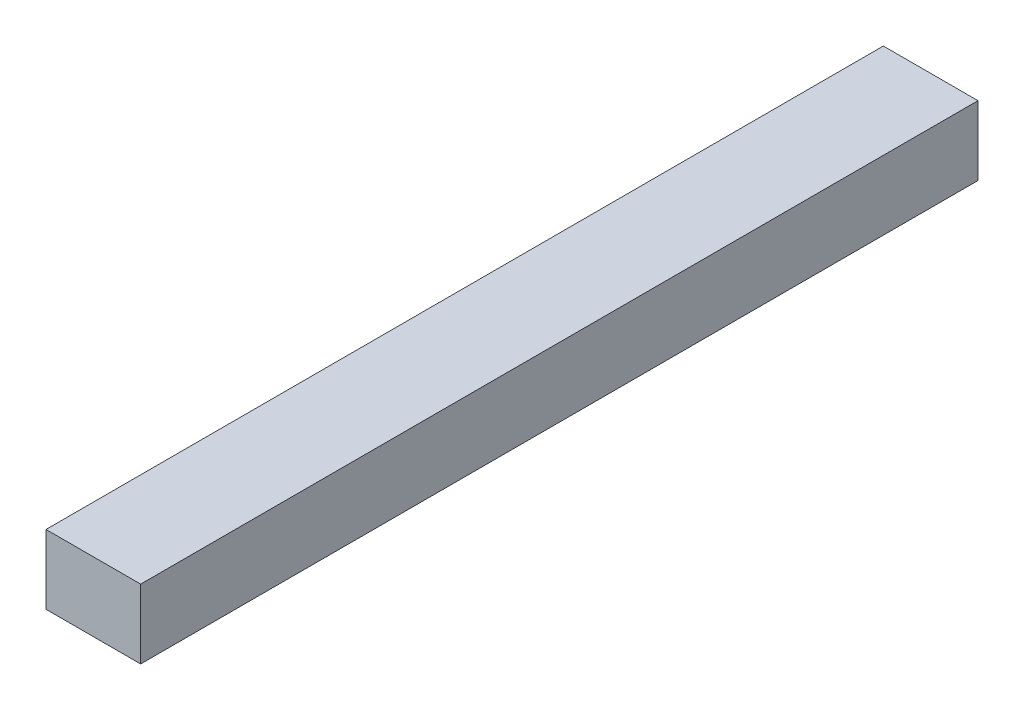
ISO-10303-21;
HEADER;
FILE_DESCRIPTION(('STEP AP214'),'2;1');
FILE_NAME('part.step','',(''),(''),'','','');
FILE_SCHEMA(('AUTOMOTIVE_DESIGN { 1 0 10303 214 1 1 1 1 }'));
ENDSEC;
DATA;
#1=APPLICATION_CONTEXT('core data for automotive mechanical design processes');
#2=APPLICATION_PROTOCOL_DEFINITION('international standard','automotive_design',2000,#1);
#3=PRODUCT_CONTEXT('',#1,'mechanical');
#4=PRODUCT('Part','Part','',(#3));
#5=PRODUCT_RELATED_PRODUCT_CATEGORY('part','',(#4));
#6=PRODUCT_DEFINITION_FORMATION('','',#4);
#7=PRODUCT_DEFINITION_CONTEXT('part definition',#1,'design');
#8=PRODUCT_DEFINITION('design','',#6,#7);
#9=PRODUCT_DEFINITION_SHAPE('','',#8);
#10=(LENGTH_UNIT() NAMED_UNIT(*) SI_UNIT(.MILLI.,.METRE.));
#11=(NAMED_UNIT(*) PLANE_ANGLE_UNIT() SI_UNIT($,.RADIAN.));
#12=(NAMED_UNIT(*) SI_UNIT($,.STERADIAN.) SOLID_ANGLE_UNIT());
#13=UNCERTAINTY_MEASURE_WITH_UNIT(LENGTH_MEASURE(1.E-05),#10,'distance_accuracy_value','');
#14=(GEOMETRIC_REPRESENTATION_CONTEXT(3) GLOBAL_UNCERTAINTY_ASSIGNED_CONTEXT((#13)) GLOBAL_UNIT_ASSIGNED_CONTEXT((#10,
#11,#12)) REPRESENTATION_CONTEXT('',''));
#15=CARTESIAN_POINT('',(0.,0.,0.));
#16=DIRECTION('',(0.,0.,1.));
#17=DIRECTION('',(1.,0.,0.));
#18=AXIS2_PLACEMENT_3D('',#15,#16,#17);
#19=CARTESIAN_POINT('',(6.5,4.75,57.5));
#20=DIRECTION('',(-1.,0.,0.));
#21=DIRECTION('',(0.,-1.,0.));
#22=AXIS2_PLACEMENT_3D('',#19,#20,#21);
#23=PLANE('',#22);
#24=DIRECTION('',(0.,1.,0.));
#25=VECTOR('',#24,1.);
#26=CARTESIAN_POINT('',(6.5,4.75,-57.5));
#27=LINE('',#26,#25);
#28=CARTESIAN_POINT('',(6.5,-4.75,-57.5));
#29=VERTEX_POINT('',#28);
#30=CARTESIAN_POINT('',(6.5,4.75,-57.5));
#31=VERTEX_POINT('',#30);
#32=EDGE_CURVE('E98',#29,#31,#27,.T.);
#33=ORIENTED_EDGE('',*,*,#32,.T.);
#34=DIRECTION('',(0.,0.,-1.));
#35=VECTOR('',#34,1.);
#36=CARTESIAN_POINT('',(6.5,4.75,57.5));
#37=LINE('',#36,#35);
#38=CARTESIAN_POINT('',(6.5,4.75,57.5));
#39=VERTEX_POINT('',#38);
#40=EDGE_CURVE('E11',#39,#31,#37,.T.);
#41=ORIENTED_EDGE('',*,*,#40,.F.);
#42=DIRECTION('',(0.,1.,0.));
#43=VECTOR('',#42,1.);
#44=CARTESIAN_POINT('',(6.5,4.75,57.5));
#45=LINE('',#44,#43);
#46=CARTESIAN_POINT('',(6.5,-4.75,57.5));
#47=VERTEX_POINT('',#46);
#48=EDGE_CURVE('E86',#47,#39,#45,.T.);
#49=ORIENTED_EDGE('',*,*,#48,.F.);
#50=DIRECTION('',(0.,0.,-1.));
#51=VECTOR('',#50,1.);
#52=CARTESIAN_POINT('',(6.5,-4.75,57.5));
#53=LINE('',#52,#51);
#54=EDGE_CURVE('E94',#47,#29,#53,.T.);
#55=ORIENTED_EDGE('',*,*,#54,.T.);
#56=EDGE_LOOP('',(#33,#41,#49,#55));
#57=FACE_BOUND('',#56,.T.);
#58=ADVANCED_FACE('F35',(#57),#23,.F.);
#59=CARTESIAN_POINT('',(-6.5,4.75,57.5));
#60=DIRECTION('',(0.,-1.,0.));
#61=DIRECTION('',(0.,0.,-1.));
#62=AXIS2_PLACEMENT_3D('',#59,#60,#61);
#63=PLANE('',#62);
#64=DIRECTION('',(-1.,0.,0.));
#65=VECTOR('',#64,1.);
#66=CARTESIAN_POINT('',(-6.5,4.75,-57.5));
#67=LINE('',#66,#65);
#68=CARTESIAN_POINT('',(-6.5,4.75,-57.5));
#69=VERTEX_POINT('',#68);
#70=EDGE_CURVE('E90',#31,#69,#67,.T.);
#71=ORIENTED_EDGE('',*,*,#70,.T.);
#72=DIRECTION('',(0.,0.,-1.));
#73=VECTOR('',#72,1.);
#74=CARTESIAN_POINT('',(-6.5,4.75,57.5));
#75=LINE('',#74,#73);
#76=CARTESIAN_POINT('',(-6.5,4.75,57.5));
#77=VERTEX_POINT('',#76);
#78=EDGE_CURVE('E43',#77,#69,#75,.T.);
#79=ORIENTED_EDGE('',*,*,#78,.F.);
#80=DIRECTION('',(-1.,0.,0.));
#81=VECTOR('',#80,1.);
#82=CARTESIAN_POINT('',(-6.5,4.75,57.5));
#83=LINE('',#82,#81);
#84=EDGE_CURVE('E81',#39,#77,#83,.T.);
#85=ORIENTED_EDGE('',*,*,#84,.F.);
#86=ORIENTED_EDGE('',*,*,#40,.T.);
#87=EDGE_LOOP('',(#71,#79,#85,#86));
#88=FACE_BOUND('',#87,.T.);
#89=ADVANCED_FACE('F89',(#88),#63,.F.);
#90=CARTESIAN_POINT('',(-6.5,4.75,57.5));
#91=DIRECTION('',(1.,0.,0.));
#92=DIRECTION('',(0.,1.,0.));
#93=AXIS2_PLACEMENT_3D('',#90,#91,#92);
#94=PLANE('',#93);
#95=DIRECTION('',(0.,-1.,0.));
#96=VECTOR('',#95,1.);
#97=CARTESIAN_POINT('',(-6.5,4.75,-57.5));
#98=LINE('',#97,#96);
#99=CARTESIAN_POINT('',(-6.5,-4.75,-57.5));
#100=VERTEX_POINT('',#99);
#101=EDGE_CURVE('E68',#69,#100,#98,.T.);
#102=ORIENTED_EDGE('',*,*,#101,.T.);
#103=DIRECTION('',(0.,0.,-1.));
#104=VECTOR('',#103,1.);
#105=CARTESIAN_POINT('',(-6.5,-4.75,57.5));
#106=LINE('',#105,#104);
#107=CARTESIAN_POINT('',(-6.5,-4.75,57.5));
#108=VERTEX_POINT('',#107);
#109=EDGE_CURVE('E91',#108,#100,#106,.T.);
#110=ORIENTED_EDGE('',*,*,#109,.F.);
#111=DIRECTION('',(0.,-1.,0.));
#112=VECTOR('',#111,1.);
#113=CARTESIAN_POINT('',(-6.5,4.75,57.5));
#114=LINE('',#113,#112);
#115=EDGE_CURVE('E84',#77,#108,#114,.T.);
#116=ORIENTED_EDGE('',*,*,#115,.F.);
#117=ORIENTED_EDGE('',*,*,#78,.T.);
#118=EDGE_LOOP('',(#102,#110,#116,#117));
#119=FACE_BOUND('',#118,.T.);
#120=ADVANCED_FACE('F92',(#119),#94,.F.);
#121=CARTESIAN_POINT('',(-6.5,-4.75,57.5));
#122=DIRECTION('',(0.,1.,0.));
#123=DIRECTION('',(0.,0.,1.));
#124=AXIS2_PLACEMENT_3D('',#121,#122,#123);
#125=PLANE('',#124);
#126=DIRECTION('',(1.,0.,0.));
#127=VECTOR('',#126,1.);
#128=CARTESIAN_POINT('',(-6.5,-4.75,-57.5));
#129=LINE('',#128,#127);
#130=EDGE_CURVE('E74',#100,#29,#129,.T.);
#131=ORIENTED_EDGE('',*,*,#130,.T.);
#132=ORIENTED_EDGE('',*,*,#54,.F.);
#133=DIRECTION('',(1.,0.,0.));
#134=VECTOR('',#133,1.);
#135=CARTESIAN_POINT('',(-6.5,-4.75,57.5));
#136=LINE('',#135,#134);
#137=EDGE_CURVE('E51',#108,#47,#136,.T.);
#138=ORIENTED_EDGE('',*,*,#137,.F.);
#139=ORIENTED_EDGE('',*,*,#109,.T.);
#140=EDGE_LOOP('',(#131,#132,#138,#139));
#141=FACE_BOUND('',#140,.T.);
#142=ADVANCED_FACE('F105',(#141),#125,.F.);
#143=CARTESIAN_POINT('',(0.,0.,57.5));
#144=DIRECTION('',(0.,0.,1.));
#145=DIRECTION('',(1.,0.,0.));
#146=AXIS2_PLACEMENT_3D('',#143,#144,#145);
#147=PLANE('',#146);
#148=ORIENTED_EDGE('',*,*,#48,.T.);
#149=ORIENTED_EDGE('',*,*,#84,.T.);
#150=ORIENTED_EDGE('',*,*,#115,.T.);
#151=ORIENTED_EDGE('',*,*,#137,.T.);
#152=EDGE_LOOP('',(#148,#149,#150,#151));
#153=FACE_BOUND('',#152,.T.);
#154=ADVANCED_FACE('F82',(#153),#147,.T.);
#155=CARTESIAN_POINT('',(0.,0.,-57.5));
#156=DIRECTION('',(0.,0.,1.));
#157=DIRECTION('',(1.,0.,0.));
#158=AXIS2_PLACEMENT_3D('',#155,#156,#157);
#159=PLANE('',#158);
#160=ORIENTED_EDGE('',*,*,#32,.F.);
#161=ORIENTED_EDGE('',*,*,#130,.F.);
#162=ORIENTED_EDGE('',*,*,#101,.F.);
#163=ORIENTED_EDGE('',*,*,#70,.F.);
#164=EDGE_LOOP('',(#160,#161,#162,#163));
#165=FACE_BOUND('',#164,.T.);
#166=ADVANCED_FACE('F108',(#165),#159,.F.);
#167=CLOSED_SHELL('',(#58,#89,#120,#142,#154,#166));
#168=MANIFOLD_SOLID_BREP('B2',#167);
#169=ADVANCED_BREP_SHAPE_REPRESENTATION('',(#18,#168),#14);
#170=SHAPE_DEFINITION_REPRESENTATION(#9,#169);
ENDSEC;
END-ISO-10303-21;
